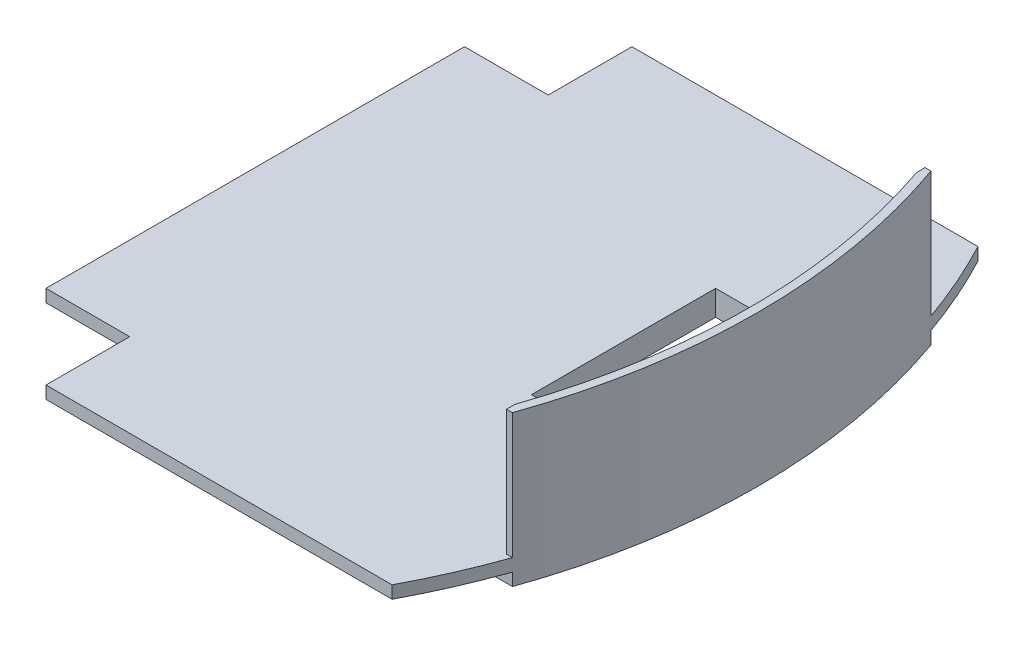
ISO-10303-21;
HEADER;
FILE_DESCRIPTION(('STEP AP214'),'2;1');
FILE_NAME('part.step','',(''),(''),'','','');
FILE_SCHEMA(('AUTOMOTIVE_DESIGN { 1 0 10303 214 1 1 1 1 }'));
ENDSEC;
DATA;
#1=APPLICATION_CONTEXT('core data for automotive mechanical design processes');
#2=APPLICATION_PROTOCOL_DEFINITION('international standard','automotive_design',2000,#1);
#3=PRODUCT_CONTEXT('',#1,'mechanical');
#4=PRODUCT('Part','Part','',(#3));
#5=PRODUCT_RELATED_PRODUCT_CATEGORY('part','',(#4));
#6=PRODUCT_DEFINITION_FORMATION('','',#4);
#7=PRODUCT_DEFINITION_CONTEXT('part definition',#1,'design');
#8=PRODUCT_DEFINITION('design','',#6,#7);
#9=PRODUCT_DEFINITION_SHAPE('','',#8);
#10=(LENGTH_UNIT() NAMED_UNIT(*) SI_UNIT(.MILLI.,.METRE.));
#11=(NAMED_UNIT(*) PLANE_ANGLE_UNIT() SI_UNIT($,.RADIAN.));
#12=(NAMED_UNIT(*) SI_UNIT($,.STERADIAN.) SOLID_ANGLE_UNIT());
#13=UNCERTAINTY_MEASURE_WITH_UNIT(LENGTH_MEASURE(1.E-05),#10,'distance_accuracy_value','');
#14=(GEOMETRIC_REPRESENTATION_CONTEXT(3) GLOBAL_UNCERTAINTY_ASSIGNED_CONTEXT((#13)) GLOBAL_UNIT_ASSIGNED_CONTEXT((#10,
#11,#12)) REPRESENTATION_CONTEXT('',''));
#15=CARTESIAN_POINT('',(0.,0.,0.));
#16=DIRECTION('',(0.,0.,1.));
#17=DIRECTION('',(1.,0.,0.));
#18=AXIS2_PLACEMENT_3D('',#15,#16,#17);
#19=CARTESIAN_POINT('',(-53.5929566320963,0.,0.));
#20=DIRECTION('',(0.,1.,0.));
#21=DIRECTION('',(0.,0.,1.));
#22=AXIS2_PLACEMENT_3D('',#19,#20,#21);
#23=PLANE('',#22);
#24=DIRECTION('',(1.,0.,0.));
#25=VECTOR('',#24,1.);
#26=CARTESIAN_POINT('',(89.9855488791226,0.,-50.));
#27=LINE('',#26,#25);
#28=CARTESIAN_POINT('',(49.9710977582451,0.,-50.));
#29=VERTEX_POINT('',#28);
#30=CARTESIAN_POINT('',(141.42135623731,0.,-50.));
#31=VERTEX_POINT('',#30);
#32=EDGE_CURVE('E222',#29,#31,#27,.T.);
#33=ORIENTED_EDGE('',*,*,#32,.T.);
#34=CARTESIAN_POINT('',(0.,0.,0.));
#35=DIRECTION('',(0.,1.,0.));
#36=DIRECTION('',(0.,0.,1.));
#37=AXIS2_PLACEMENT_3D('',#34,#35,#36);
#38=CIRCLE('',#37,150.);
#39=CARTESIAN_POINT('',(141.42135623731,0.,50.));
#40=VERTEX_POINT('',#39);
#41=EDGE_CURVE('E263',#40,#31,#38,.T.);
#42=ORIENTED_EDGE('',*,*,#41,.F.);
#43=DIRECTION('',(1.,0.,0.));
#44=VECTOR('',#43,1.);
#45=CARTESIAN_POINT('',(89.9855488791226,0.,50.));
#46=LINE('',#45,#44);
#47=CARTESIAN_POINT('',(49.9710977582451,0.,50.));
#48=VERTEX_POINT('',#47);
#49=EDGE_CURVE('E243',#48,#40,#46,.T.);
#50=ORIENTED_EDGE('',*,*,#49,.F.);
#51=DIRECTION('',(0.,0.,-1.));
#52=VECTOR('',#51,1.);
#53=CARTESIAN_POINT('',(49.9710977582451,0.,0.));
#54=LINE('',#53,#52);
#55=EDGE_CURVE('E268',#48,#29,#54,.T.);
#56=ORIENTED_EDGE('',*,*,#55,.T.);
#57=EDGE_LOOP('',(#33,#42,#50,#56));
#58=FACE_BOUND('',#57,.T.);
#59=DIRECTION('',(0.,0.,-1.));
#60=VECTOR('',#59,1.);
#61=CARTESIAN_POINT('',(130.971097758245,0.,-110.157318737628));
#62=LINE('',#61,#60);
#63=CARTESIAN_POINT('',(130.971097758245,0.,14.));
#64=VERTEX_POINT('',#63);
#65=CARTESIAN_POINT('',(130.971097758245,0.,-30.));
#66=VERTEX_POINT('',#65);
#67=EDGE_CURVE('E53',#64,#66,#62,.T.);
#68=ORIENTED_EDGE('',*,*,#67,.T.);
#69=DIRECTION('',(1.,0.,0.));
#70=VECTOR('',#69,1.);
#71=CARTESIAN_POINT('',(99.9855488791226,0.,-30.));
#72=LINE('',#71,#70);
#73=CARTESIAN_POINT('',(109.971097758245,0.,-30.));
#74=VERTEX_POINT('',#73);
#75=EDGE_CURVE('E392',#74,#66,#72,.T.);
#76=ORIENTED_EDGE('',*,*,#75,.F.);
#77=DIRECTION('',(0.,0.,-1.));
#78=VECTOR('',#77,1.);
#79=CARTESIAN_POINT('',(109.971097758245,0.,-110.157318737628));
#80=LINE('',#79,#78);
#81=CARTESIAN_POINT('',(109.971097758245,0.,14.));
#82=VERTEX_POINT('',#81);
#83=EDGE_CURVE('E396',#82,#74,#80,.T.);
#84=ORIENTED_EDGE('',*,*,#83,.F.);
#85=DIRECTION('',(1.,0.,0.));
#86=VECTOR('',#85,1.);
#87=CARTESIAN_POINT('',(99.9855488791226,0.,14.));
#88=LINE('',#87,#86);
#89=EDGE_CURVE('E399',#82,#64,#88,.T.);
#90=ORIENTED_EDGE('',*,*,#89,.T.);
#91=EDGE_LOOP('',(#68,#76,#84,#90));
#92=FACE_BOUND('',#91,.T.);
#93=ADVANCED_FACE('F35',(#58,#92),#23,.F.);
#94=CARTESIAN_POINT('',(-53.5929566320963,36.,0.));
#95=DIRECTION('',(0.,1.,0.));
#96=DIRECTION('',(0.,0.,1.));
#97=AXIS2_PLACEMENT_3D('',#94,#95,#96);
#98=PLANE('',#97);
#99=DIRECTION('',(0.,0.,1.));
#100=VECTOR('',#99,1.);
#101=CARTESIAN_POINT('',(140.,36.,-70.000025));
#102=LINE('',#101,#100);
#103=CARTESIAN_POINT('',(140.,36.,48.));
#104=VERTEX_POINT('',#103);
#105=CARTESIAN_POINT('',(140.,36.,50.));
#106=VERTEX_POINT('',#105);
#107=EDGE_CURVE('E412',#104,#106,#102,.T.);
#108=ORIENTED_EDGE('',*,*,#107,.T.);
#109=DIRECTION('',(1.,0.,0.));
#110=VECTOR('',#109,1.);
#111=CARTESIAN_POINT('',(-53.5929566320963,36.,50.));
#112=LINE('',#111,#110);
#113=CARTESIAN_POINT('',(141.42135623731,36.,50.));
#114=VERTEX_POINT('',#113);
#115=EDGE_CURVE('E200',#106,#114,#112,.T.);
#116=ORIENTED_EDGE('',*,*,#115,.T.);
#117=CARTESIAN_POINT('',(0.,36.,0.));
#118=DIRECTION('',(0.,1.,0.));
#119=DIRECTION('',(0.,0.,1.));
#120=AXIS2_PLACEMENT_3D('',#117,#118,#119);
#121=CIRCLE('',#120,150.);
#122=CARTESIAN_POINT('',(141.42135623731,36.,-50.));
#123=VERTEX_POINT('',#122);
#124=EDGE_CURVE('E216',#114,#123,#121,.T.);
#125=ORIENTED_EDGE('',*,*,#124,.T.);
#126=DIRECTION('',(1.,0.,0.));
#127=VECTOR('',#126,1.);
#128=CARTESIAN_POINT('',(-53.5929566320963,36.,-50.));
#129=LINE('',#128,#127);
#130=CARTESIAN_POINT('',(140.,36.,-50.));
#131=VERTEX_POINT('',#130);
#132=EDGE_CURVE('E207',#131,#123,#129,.T.);
#133=ORIENTED_EDGE('',*,*,#132,.F.);
#134=CARTESIAN_POINT('',(140.,36.,-48.));
#135=VERTEX_POINT('',#134);
#136=EDGE_CURVE('E410',#131,#135,#102,.T.);
#137=ORIENTED_EDGE('',*,*,#136,.T.);
#138=CARTESIAN_POINT('',(0.,36.,0.));
#139=DIRECTION('',(0.,1.,0.));
#140=DIRECTION('',(0.,0.,1.));
#141=AXIS2_PLACEMENT_3D('',#138,#139,#140);
#142=CIRCLE('',#141,148.);
#143=EDGE_CURVE('E374',#104,#135,#142,.T.);
#144=ORIENTED_EDGE('',*,*,#143,.F.);
#145=EDGE_LOOP('',(#108,#116,#125,#133,#137,#144));
#146=FACE_BOUND('',#145,.T.);
#147=ADVANCED_FACE('F420',(#146),#98,.T.);
#148=CARTESIAN_POINT('',(-53.5929566320963,6.,0.));
#149=DIRECTION('',(0.,1.,0.));
#150=DIRECTION('',(0.,0.,1.));
#151=AXIS2_PLACEMENT_3D('',#148,#149,#150);
#152=PLANE('',#151);
#153=DIRECTION('',(1.,0.,0.));
#154=VECTOR('',#153,1.);
#155=CARTESIAN_POINT('',(-53.5929566320963,6.,50.));
#156=LINE('',#155,#154);
#157=CARTESIAN_POINT('',(140.,6.,50.));
#158=VERTEX_POINT('',#157);
#159=CARTESIAN_POINT('',(141.42135623731,6.,50.));
#160=VERTEX_POINT('',#159);
#161=EDGE_CURVE('E198',#158,#160,#156,.T.);
#162=ORIENTED_EDGE('',*,*,#161,.F.);
#163=DIRECTION('',(0.,0.,1.));
#164=VECTOR('',#163,1.);
#165=CARTESIAN_POINT('',(140.,6.,-70.000025));
#166=LINE('',#165,#164);
#167=CARTESIAN_POINT('',(140.,6.,48.));
#168=VERTEX_POINT('',#167);
#169=EDGE_CURVE('E181',#168,#158,#166,.T.);
#170=ORIENTED_EDGE('',*,*,#169,.F.);
#171=CARTESIAN_POINT('',(0.,6.,0.));
#172=DIRECTION('',(0.,1.,0.));
#173=DIRECTION('',(0.,0.,1.));
#174=AXIS2_PLACEMENT_3D('',#171,#172,#173);
#175=CIRCLE('',#174,148.);
#176=CARTESIAN_POINT('',(140.,6.,-48.));
#177=VERTEX_POINT('',#176);
#178=EDGE_CURVE('E378',#168,#177,#175,.T.);
#179=ORIENTED_EDGE('',*,*,#178,.T.);
#180=CARTESIAN_POINT('',(140.,6.,-50.));
#181=VERTEX_POINT('',#180);
#182=EDGE_CURVE('E192',#181,#177,#166,.T.);
#183=ORIENTED_EDGE('',*,*,#182,.F.);
#184=DIRECTION('',(1.,0.,0.));
#185=VECTOR('',#184,1.);
#186=CARTESIAN_POINT('',(-53.5929566320963,6.,-50.));
#187=LINE('',#186,#185);
#188=CARTESIAN_POINT('',(141.42135623731,6.,-50.));
#189=VERTEX_POINT('',#188);
#190=EDGE_CURVE('E39',#181,#189,#187,.T.);
#191=ORIENTED_EDGE('',*,*,#190,.T.);
#192=CARTESIAN_POINT('',(0.,6.,0.));
#193=DIRECTION('',(0.,1.,0.));
#194=DIRECTION('',(0.,0.,1.));
#195=AXIS2_PLACEMENT_3D('',#192,#193,#194);
#196=CIRCLE('',#195,150.);
#197=CARTESIAN_POINT('',(132.664991614216,6.,-70.));
#198=VERTEX_POINT('',#197);
#199=EDGE_CURVE('E272',#189,#198,#196,.T.);
#200=ORIENTED_EDGE('',*,*,#199,.T.);
#201=DIRECTION('',(1.,0.,0.));
#202=VECTOR('',#201,1.);
#203=CARTESIAN_POINT('',(-53.5929566320963,6.,-70.));
#204=LINE('',#203,#202);
#205=CARTESIAN_POINT('',(49.9710977582451,6.,-70.));
#206=VERTEX_POINT('',#205);
#207=EDGE_CURVE('E275',#206,#198,#204,.T.);
#208=ORIENTED_EDGE('',*,*,#207,.F.);
#209=DIRECTION('',(0.,0.,-1.));
#210=VECTOR('',#209,1.);
#211=CARTESIAN_POINT('',(49.9710977582451,6.,0.));
#212=LINE('',#211,#210);
#213=CARTESIAN_POINT('',(49.9710977582451,6.,-50.));
#214=VERTEX_POINT('',#213);
#215=EDGE_CURVE('E310',#214,#206,#212,.T.);
#216=ORIENTED_EDGE('',*,*,#215,.F.);
#217=DIRECTION('',(1.,0.,0.));
#218=VECTOR('',#217,1.);
#219=CARTESIAN_POINT('',(-53.5929566320963,6.,-50.));
#220=LINE('',#219,#218);
#221=CARTESIAN_POINT('',(29.9710977582451,6.,-50.));
#222=VERTEX_POINT('',#221);
#223=EDGE_CURVE('E308',#222,#214,#220,.T.);
#224=ORIENTED_EDGE('',*,*,#223,.F.);
#225=DIRECTION('',(0.,0.,-1.));
#226=VECTOR('',#225,1.);
#227=CARTESIAN_POINT('',(29.9710977582451,6.,0.));
#228=LINE('',#227,#226);
#229=CARTESIAN_POINT('',(29.9710977582451,6.,50.));
#230=VERTEX_POINT('',#229);
#231=EDGE_CURVE('E301',#230,#222,#228,.T.);
#232=ORIENTED_EDGE('',*,*,#231,.F.);
#233=DIRECTION('',(1.,0.,0.));
#234=VECTOR('',#233,1.);
#235=CARTESIAN_POINT('',(-53.5929566320963,6.,50.));
#236=LINE('',#235,#234);
#237=CARTESIAN_POINT('',(49.9710977582451,6.,50.));
#238=VERTEX_POINT('',#237);
#239=EDGE_CURVE('E264',#230,#238,#236,.T.);
#240=ORIENTED_EDGE('',*,*,#239,.T.);
#241=DIRECTION('',(0.,0.,1.));
#242=VECTOR('',#241,1.);
#243=CARTESIAN_POINT('',(49.9710977582451,6.,0.));
#244=LINE('',#243,#242);
#245=CARTESIAN_POINT('',(49.9710977582451,6.,70.));
#246=VERTEX_POINT('',#245);
#247=EDGE_CURVE('E267',#238,#246,#244,.T.);
#248=ORIENTED_EDGE('',*,*,#247,.T.);
#249=DIRECTION('',(1.,0.,0.));
#250=VECTOR('',#249,1.);
#251=CARTESIAN_POINT('',(-53.5929566320963,6.,70.));
#252=LINE('',#251,#250);
#253=CARTESIAN_POINT('',(132.664991614216,6.,70.));
#254=VERTEX_POINT('',#253);
#255=EDGE_CURVE('E270',#246,#254,#252,.T.);
#256=ORIENTED_EDGE('',*,*,#255,.T.);
#257=EDGE_CURVE('E205',#254,#160,#196,.T.);
#258=ORIENTED_EDGE('',*,*,#257,.T.);
#259=EDGE_LOOP('',(#162,#170,#179,#183,#191,#200,#208,#216,#224,#232,#240,#248,#256,#258));
#260=FACE_BOUND('',#259,.T.);
#261=DIRECTION('',(1.,0.,0.));
#262=VECTOR('',#261,1.);
#263=CARTESIAN_POINT('',(99.9855488791226,6.,-30.));
#264=LINE('',#263,#262);
#265=CARTESIAN_POINT('',(109.971097758245,6.,-30.));
#266=VERTEX_POINT('',#265);
#267=CARTESIAN_POINT('',(130.971097758245,6.,-30.));
#268=VERTEX_POINT('',#267);
#269=EDGE_CURVE('E387',#266,#268,#264,.T.);
#270=ORIENTED_EDGE('',*,*,#269,.T.);
#271=DIRECTION('',(0.,0.,-1.));
#272=VECTOR('',#271,1.);
#273=CARTESIAN_POINT('',(130.971097758245,6.,-110.157318737628));
#274=LINE('',#273,#272);
#275=CARTESIAN_POINT('',(130.971097758245,6.,14.));
#276=VERTEX_POINT('',#275);
#277=EDGE_CURVE('E395',#276,#268,#274,.T.);
#278=ORIENTED_EDGE('',*,*,#277,.F.);
#279=DIRECTION('',(1.,0.,0.));
#280=VECTOR('',#279,1.);
#281=CARTESIAN_POINT('',(99.9855488791226,6.,14.));
#282=LINE('',#281,#280);
#283=CARTESIAN_POINT('',(109.971097758245,6.,14.));
#284=VERTEX_POINT('',#283);
#285=EDGE_CURVE('E407',#284,#276,#282,.T.);
#286=ORIENTED_EDGE('',*,*,#285,.F.);
#287=DIRECTION('',(0.,0.,-1.));
#288=VECTOR('',#287,1.);
#289=CARTESIAN_POINT('',(109.971097758245,6.,-110.157318737628));
#290=LINE('',#289,#288);
#291=EDGE_CURVE('E61',#284,#266,#290,.T.);
#292=ORIENTED_EDGE('',*,*,#291,.T.);
#293=EDGE_LOOP('',(#270,#278,#286,#292));
#294=FACE_BOUND('',#293,.T.);
#295=ADVANCED_FACE('F202',(#260,#294),#152,.T.);
#296=CARTESIAN_POINT('',(0.,6.,0.));
#297=DIRECTION('',(0.,-1.,0.));
#298=DIRECTION('',(0.,0.,-1.));
#299=AXIS2_PLACEMENT_3D('',#296,#297,#298);
#300=CYLINDRICAL_SURFACE('',#299,150.);
#301=DIRECTION('',(0.,-1.,0.));
#302=VECTOR('',#301,1.);
#303=CARTESIAN_POINT('',(141.42135623731,36.,50.));
#304=LINE('',#303,#302);
#305=EDGE_CURVE('E228',#114,#160,#304,.T.);
#306=ORIENTED_EDGE('',*,*,#305,.T.);
#307=ORIENTED_EDGE('',*,*,#257,.F.);
#308=DIRECTION('',(0.,-1.,0.));
#309=VECTOR('',#308,1.);
#310=CARTESIAN_POINT('',(132.664991614216,6.,70.));
#311=LINE('',#310,#309);
#312=CARTESIAN_POINT('',(132.664991614216,3.,70.));
#313=VERTEX_POINT('',#312);
#314=EDGE_CURVE('E283',#254,#313,#311,.T.);
#315=ORIENTED_EDGE('',*,*,#314,.T.);
#316=CARTESIAN_POINT('',(0.,3.,0.));
#317=DIRECTION('',(0.,-1.,0.));
#318=DIRECTION('',(0.,0.,-1.));
#319=AXIS2_PLACEMENT_3D('',#316,#317,#318);
#320=CIRCLE('',#319,150.);
#321=CARTESIAN_POINT('',(141.42135623731,3.,50.));
#322=VERTEX_POINT('',#321);
#323=EDGE_CURVE('E248',#322,#313,#320,.T.);
#324=ORIENTED_EDGE('',*,*,#323,.F.);
#325=DIRECTION('',(0.,-1.,0.));
#326=VECTOR('',#325,1.);
#327=CARTESIAN_POINT('',(141.42135623731,3.,50.));
#328=LINE('',#327,#326);
#329=EDGE_CURVE('E240',#322,#40,#328,.T.);
#330=ORIENTED_EDGE('',*,*,#329,.T.);
#331=ORIENTED_EDGE('',*,*,#41,.T.);
#332=DIRECTION('',(0.,-1.,0.));
#333=VECTOR('',#332,1.);
#334=CARTESIAN_POINT('',(141.42135623731,3.,-50.));
#335=LINE('',#334,#333);
#336=CARTESIAN_POINT('',(141.42135623731,3.,-50.));
#337=VERTEX_POINT('',#336);
#338=EDGE_CURVE('E223',#337,#31,#335,.T.);
#339=ORIENTED_EDGE('',*,*,#338,.F.);
#340=CARTESIAN_POINT('',(0.,3.,0.));
#341=DIRECTION('',(0.,-1.,0.));
#342=DIRECTION('',(0.,0.,-1.));
#343=AXIS2_PLACEMENT_3D('',#340,#341,#342);
#344=CIRCLE('',#343,150.);
#345=CARTESIAN_POINT('',(132.664991614216,3.,-70.));
#346=VERTEX_POINT('',#345);
#347=EDGE_CURVE('E221',#346,#337,#344,.T.);
#348=ORIENTED_EDGE('',*,*,#347,.F.);
#349=DIRECTION('',(0.,-1.,0.));
#350=VECTOR('',#349,1.);
#351=CARTESIAN_POINT('',(132.664991614216,6.,-70.));
#352=LINE('',#351,#350);
#353=EDGE_CURVE('E286',#198,#346,#352,.T.);
#354=ORIENTED_EDGE('',*,*,#353,.F.);
#355=ORIENTED_EDGE('',*,*,#199,.F.);
#356=DIRECTION('',(0.,-1.,0.));
#357=VECTOR('',#356,1.);
#358=CARTESIAN_POINT('',(141.42135623731,36.,-50.));
#359=LINE('',#358,#357);
#360=EDGE_CURVE('E365',#123,#189,#359,.T.);
#361=ORIENTED_EDGE('',*,*,#360,.F.);
#362=ORIENTED_EDGE('',*,*,#124,.F.);
#363=EDGE_LOOP('',(#306,#307,#315,#324,#330,#331,#339,#348,#354,#355,#361,#362));
#364=FACE_BOUND('',#363,.T.);
#365=ADVANCED_FACE('F328',(#364),#300,.T.);
#366=CARTESIAN_POINT('',(-53.5929566320963,6.,-70.));
#367=DIRECTION('',(0.,0.,-1.));
#368=DIRECTION('',(-1.,0.,0.));
#369=AXIS2_PLACEMENT_3D('',#366,#367,#368);
#370=PLANE('',#369);
#371=ORIENTED_EDGE('',*,*,#353,.T.);
#372=DIRECTION('',(1.,0.,0.));
#373=VECTOR('',#372,1.);
#374=CARTESIAN_POINT('',(89.9855488791226,3.,-70.));
#375=LINE('',#374,#373);
#376=CARTESIAN_POINT('',(49.9710977582451,3.,-70.));
#377=VERTEX_POINT('',#376);
#378=EDGE_CURVE('E225',#377,#346,#375,.T.);
#379=ORIENTED_EDGE('',*,*,#378,.F.);
#380=DIRECTION('',(0.,-1.,0.));
#381=VECTOR('',#380,1.);
#382=CARTESIAN_POINT('',(49.9710977582451,6.,-70.));
#383=LINE('',#382,#381);
#384=EDGE_CURVE('E289',#206,#377,#383,.T.);
#385=ORIENTED_EDGE('',*,*,#384,.F.);
#386=ORIENTED_EDGE('',*,*,#207,.T.);
#387=EDGE_LOOP('',(#371,#379,#385,#386));
#388=FACE_BOUND('',#387,.T.);
#389=ADVANCED_FACE('F317',(#388),#370,.T.);
#390=CARTESIAN_POINT('',(49.9710977582451,6.,0.));
#391=DIRECTION('',(-1.,0.,0.));
#392=DIRECTION('',(0.,0.,1.));
#393=AXIS2_PLACEMENT_3D('',#390,#391,#392);
#394=PLANE('',#393);
#395=DIRECTION('',(0.,0.,-1.));
#396=VECTOR('',#395,1.);
#397=CARTESIAN_POINT('',(49.9710977582451,3.,-143.578505511219));
#398=LINE('',#397,#396);
#399=CARTESIAN_POINT('',(49.9710977582451,3.,50.));
#400=VERTEX_POINT('',#399);
#401=CARTESIAN_POINT('',(49.9710977582451,3.,-50.));
#402=VERTEX_POINT('',#401);
#403=EDGE_CURVE('E246',#400,#402,#398,.T.);
#404=ORIENTED_EDGE('',*,*,#403,.T.);
#405=DIRECTION('',(0.,-1.,0.));
#406=VECTOR('',#405,1.);
#407=CARTESIAN_POINT('',(49.9710977582451,3.,-50.));
#408=LINE('',#407,#406);
#409=EDGE_CURVE('E218',#402,#29,#408,.T.);
#410=ORIENTED_EDGE('',*,*,#409,.T.);
#411=ORIENTED_EDGE('',*,*,#55,.F.);
#412=DIRECTION('',(0.,-1.,0.));
#413=VECTOR('',#412,1.);
#414=CARTESIAN_POINT('',(49.9710977582451,3.,50.));
#415=LINE('',#414,#413);
#416=EDGE_CURVE('E237',#400,#48,#415,.T.);
#417=ORIENTED_EDGE('',*,*,#416,.F.);
#418=EDGE_LOOP('',(#404,#410,#411,#417));
#419=FACE_BOUND('',#418,.T.);
#420=ADVANCED_FACE('F338',(#419),#394,.T.);
#421=ORIENTED_EDGE('',*,*,#384,.T.);
#422=DIRECTION('',(0.,0.,-1.));
#423=VECTOR('',#422,1.);
#424=CARTESIAN_POINT('',(49.9710977582451,3.,-143.578505511219));
#425=LINE('',#424,#423);
#426=EDGE_CURVE('E232',#402,#377,#425,.T.);
#427=ORIENTED_EDGE('',*,*,#426,.F.);
#428=DIRECTION('',(0.,-1.,0.));
#429=VECTOR('',#428,1.);
#430=CARTESIAN_POINT('',(49.9710977582451,6.,-50.));
#431=LINE('',#430,#429);
#432=EDGE_CURVE('E292',#214,#402,#431,.T.);
#433=ORIENTED_EDGE('',*,*,#432,.F.);
#434=ORIENTED_EDGE('',*,*,#215,.T.);
#435=EDGE_LOOP('',(#421,#427,#433,#434));
#436=FACE_BOUND('',#435,.T.);
#437=ADVANCED_FACE('F334',(#436),#394,.T.);
#438=CARTESIAN_POINT('',(-53.5929566320963,6.,70.));
#439=DIRECTION('',(0.,0.,-1.));
#440=DIRECTION('',(-1.,0.,0.));
#441=AXIS2_PLACEMENT_3D('',#438,#439,#440);
#442=PLANE('',#441);
#443=DIRECTION('',(-1.,0.,0.));
#444=VECTOR('',#443,1.);
#445=CARTESIAN_POINT('',(89.9855488791226,3.,70.));
#446=LINE('',#445,#444);
#447=CARTESIAN_POINT('',(49.9710977582451,3.,70.));
#448=VERTEX_POINT('',#447);
#449=EDGE_CURVE('E239',#313,#448,#446,.T.);
#450=ORIENTED_EDGE('',*,*,#449,.F.);
#451=ORIENTED_EDGE('',*,*,#314,.F.);
#452=ORIENTED_EDGE('',*,*,#255,.F.);
#453=DIRECTION('',(0.,-1.,0.));
#454=VECTOR('',#453,1.);
#455=CARTESIAN_POINT('',(49.9710977582451,6.,70.));
#456=LINE('',#455,#454);
#457=EDGE_CURVE('E45',#246,#448,#456,.T.);
#458=ORIENTED_EDGE('',*,*,#457,.T.);
#459=EDGE_LOOP('',(#450,#451,#452,#458));
#460=FACE_BOUND('',#459,.T.);
#461=ADVANCED_FACE('F361',(#460),#442,.F.);
#462=DIRECTION('',(0.,-1.,0.));
#463=VECTOR('',#462,1.);
#464=CARTESIAN_POINT('',(49.9710977582451,6.,50.));
#465=LINE('',#464,#463);
#466=EDGE_CURVE('E11',#238,#400,#465,.T.);
#467=ORIENTED_EDGE('',*,*,#466,.T.);
#468=DIRECTION('',(0.,0.,-1.));
#469=VECTOR('',#468,1.);
#470=CARTESIAN_POINT('',(49.9710977582451,3.,-143.578505511219));
#471=LINE('',#470,#469);
#472=EDGE_CURVE('E236',#448,#400,#471,.T.);
#473=ORIENTED_EDGE('',*,*,#472,.F.);
#474=ORIENTED_EDGE('',*,*,#457,.F.);
#475=ORIENTED_EDGE('',*,*,#247,.F.);
#476=EDGE_LOOP('',(#467,#473,#474,#475));
#477=FACE_BOUND('',#476,.T.);
#478=ADVANCED_FACE('F355',(#477),#394,.T.);
#479=CARTESIAN_POINT('',(-53.5929566320963,6.,50.));
#480=DIRECTION('',(0.,0.,-1.));
#481=DIRECTION('',(-1.,0.,0.));
#482=AXIS2_PLACEMENT_3D('',#479,#480,#481);
#483=PLANE('',#482);
#484=DIRECTION('',(-1.,0.,0.));
#485=VECTOR('',#484,1.);
#486=CARTESIAN_POINT('',(89.9855488791226,3.,50.));
#487=LINE('',#486,#485);
#488=CARTESIAN_POINT('',(29.9710977582451,3.,50.));
#489=VERTEX_POINT('',#488);
#490=EDGE_CURVE('E256',#400,#489,#487,.T.);
#491=ORIENTED_EDGE('',*,*,#490,.F.);
#492=ORIENTED_EDGE('',*,*,#466,.F.);
#493=ORIENTED_EDGE('',*,*,#239,.F.);
#494=DIRECTION('',(0.,-1.,0.));
#495=VECTOR('',#494,1.);
#496=CARTESIAN_POINT('',(29.9710977582451,6.,50.));
#497=LINE('',#496,#495);
#498=EDGE_CURVE('E298',#230,#489,#497,.T.);
#499=ORIENTED_EDGE('',*,*,#498,.T.);
#500=EDGE_LOOP('',(#491,#492,#493,#499));
#501=FACE_BOUND('',#500,.T.);
#502=ADVANCED_FACE('F37',(#501),#483,.F.);
#503=CARTESIAN_POINT('',(-53.5929566320963,6.,-50.));
#504=DIRECTION('',(0.,0.,-1.));
#505=DIRECTION('',(-1.,0.,0.));
#506=AXIS2_PLACEMENT_3D('',#503,#504,#505);
#507=PLANE('',#506);
#508=ORIENTED_EDGE('',*,*,#432,.T.);
#509=DIRECTION('',(1.,0.,0.));
#510=VECTOR('',#509,1.);
#511=CARTESIAN_POINT('',(89.9855488791226,3.,-50.));
#512=LINE('',#511,#510);
#513=CARTESIAN_POINT('',(29.9710977582451,3.,-50.));
#514=VERTEX_POINT('',#513);
#515=EDGE_CURVE('E260',#514,#402,#512,.T.);
#516=ORIENTED_EDGE('',*,*,#515,.F.);
#517=DIRECTION('',(0.,-1.,0.));
#518=VECTOR('',#517,1.);
#519=CARTESIAN_POINT('',(29.9710977582451,6.,-50.));
#520=LINE('',#519,#518);
#521=EDGE_CURVE('E295',#222,#514,#520,.T.);
#522=ORIENTED_EDGE('',*,*,#521,.F.);
#523=ORIENTED_EDGE('',*,*,#223,.T.);
#524=EDGE_LOOP('',(#508,#516,#522,#523));
#525=FACE_BOUND('',#524,.T.);
#526=ADVANCED_FACE('F346',(#525),#507,.T.);
#527=CARTESIAN_POINT('',(29.9710977582451,6.,0.));
#528=DIRECTION('',(-1.,0.,0.));
#529=DIRECTION('',(0.,0.,1.));
#530=AXIS2_PLACEMENT_3D('',#527,#528,#529);
#531=PLANE('',#530);
#532=ORIENTED_EDGE('',*,*,#521,.T.);
#533=DIRECTION('',(0.,0.,-1.));
#534=VECTOR('',#533,1.);
#535=CARTESIAN_POINT('',(29.9710977582451,3.,-143.578505511219));
#536=LINE('',#535,#534);
#537=EDGE_CURVE('E258',#489,#514,#536,.T.);
#538=ORIENTED_EDGE('',*,*,#537,.F.);
#539=ORIENTED_EDGE('',*,*,#498,.F.);
#540=ORIENTED_EDGE('',*,*,#231,.T.);
#541=EDGE_LOOP('',(#532,#538,#539,#540));
#542=FACE_BOUND('',#541,.T.);
#543=ADVANCED_FACE('F349',(#542),#531,.T.);
#544=CARTESIAN_POINT('',(89.9855488791226,3.,-143.578505511219));
#545=DIRECTION('',(0.,-1.,0.));
#546=DIRECTION('',(0.,0.,-1.));
#547=AXIS2_PLACEMENT_3D('',#544,#545,#546);
#548=PLANE('',#547);
#549=ORIENTED_EDGE('',*,*,#403,.F.);
#550=ORIENTED_EDGE('',*,*,#490,.T.);
#551=ORIENTED_EDGE('',*,*,#537,.T.);
#552=ORIENTED_EDGE('',*,*,#515,.T.);
#553=EDGE_LOOP('',(#549,#550,#551,#552));
#554=FACE_BOUND('',#553,.T.);
#555=ADVANCED_FACE('F343',(#554),#548,.T.);
#556=CARTESIAN_POINT('',(89.9855488791226,3.,50.));
#557=DIRECTION('',(0.,0.,-1.));
#558=DIRECTION('',(-1.,0.,0.));
#559=AXIS2_PLACEMENT_3D('',#556,#557,#558);
#560=PLANE('',#559);
#561=ORIENTED_EDGE('',*,*,#49,.T.);
#562=ORIENTED_EDGE('',*,*,#329,.F.);
#563=DIRECTION('',(1.,0.,0.));
#564=VECTOR('',#563,1.);
#565=CARTESIAN_POINT('',(89.9855488791226,3.,50.));
#566=LINE('',#565,#564);
#567=EDGE_CURVE('E244',#400,#322,#566,.T.);
#568=ORIENTED_EDGE('',*,*,#567,.F.);
#569=ORIENTED_EDGE('',*,*,#416,.T.);
#570=EDGE_LOOP('',(#561,#562,#568,#569));
#571=FACE_BOUND('',#570,.T.);
#572=ADVANCED_FACE('F489',(#571),#560,.F.);
#573=CARTESIAN_POINT('',(89.9855488791226,3.,-143.578505511219));
#574=DIRECTION('',(0.,-1.,0.));
#575=DIRECTION('',(0.,0.,-1.));
#576=AXIS2_PLACEMENT_3D('',#573,#574,#575);
#577=PLANE('',#576);
#578=ORIENTED_EDGE('',*,*,#472,.T.);
#579=ORIENTED_EDGE('',*,*,#567,.T.);
#580=ORIENTED_EDGE('',*,*,#323,.T.);
#581=ORIENTED_EDGE('',*,*,#449,.T.);
#582=EDGE_LOOP('',(#578,#579,#580,#581));
#583=FACE_BOUND('',#582,.T.);
#584=ADVANCED_FACE('F495',(#583),#577,.T.);
#585=CARTESIAN_POINT('',(89.9855488791226,3.,-50.));
#586=DIRECTION('',(0.,0.,-1.));
#587=DIRECTION('',(-1.,0.,0.));
#588=AXIS2_PLACEMENT_3D('',#585,#586,#587);
#589=PLANE('',#588);
#590=ORIENTED_EDGE('',*,*,#32,.F.);
#591=ORIENTED_EDGE('',*,*,#409,.F.);
#592=DIRECTION('',(1.,0.,0.));
#593=VECTOR('',#592,1.);
#594=CARTESIAN_POINT('',(89.9855488791226,3.,-50.));
#595=LINE('',#594,#593);
#596=EDGE_CURVE('E234',#402,#337,#595,.T.);
#597=ORIENTED_EDGE('',*,*,#596,.T.);
#598=ORIENTED_EDGE('',*,*,#338,.T.);
#599=EDGE_LOOP('',(#590,#591,#597,#598));
#600=FACE_BOUND('',#599,.T.);
#601=ADVANCED_FACE('F430',(#600),#589,.T.);
#602=CARTESIAN_POINT('',(89.9855488791226,3.,-143.578505511219));
#603=DIRECTION('',(0.,-1.,0.));
#604=DIRECTION('',(0.,0.,-1.));
#605=AXIS2_PLACEMENT_3D('',#602,#603,#604);
#606=PLANE('',#605);
#607=ORIENTED_EDGE('',*,*,#596,.F.);
#608=ORIENTED_EDGE('',*,*,#426,.T.);
#609=ORIENTED_EDGE('',*,*,#378,.T.);
#610=ORIENTED_EDGE('',*,*,#347,.T.);
#611=EDGE_LOOP('',(#607,#608,#609,#610));
#612=FACE_BOUND('',#611,.T.);
#613=ADVANCED_FACE('F331',(#612),#606,.T.);
#614=CARTESIAN_POINT('',(-53.5929566320963,36.,-50.));
#615=DIRECTION('',(0.,0.,-1.));
#616=DIRECTION('',(-1.,0.,0.));
#617=AXIS2_PLACEMENT_3D('',#614,#615,#616);
#618=PLANE('',#617);
#619=DIRECTION('',(0.,-1.,0.));
#620=VECTOR('',#619,1.);
#621=CARTESIAN_POINT('',(140.,36.0000000000002,-50.));
#622=LINE('',#621,#620);
#623=EDGE_CURVE('E403',#131,#181,#622,.T.);
#624=ORIENTED_EDGE('',*,*,#623,.F.);
#625=ORIENTED_EDGE('',*,*,#132,.T.);
#626=ORIENTED_EDGE('',*,*,#360,.T.);
#627=ORIENTED_EDGE('',*,*,#190,.F.);
#628=EDGE_LOOP('',(#624,#625,#626,#627));
#629=FACE_BOUND('',#628,.T.);
#630=ADVANCED_FACE('F421',(#629),#618,.T.);
#631=CARTESIAN_POINT('',(-53.5929566320963,36.,50.));
#632=DIRECTION('',(0.,0.,-1.));
#633=DIRECTION('',(-1.,0.,0.));
#634=AXIS2_PLACEMENT_3D('',#631,#632,#633);
#635=PLANE('',#634);
#636=ORIENTED_EDGE('',*,*,#115,.F.);
#637=DIRECTION('',(0.,1.,0.));
#638=VECTOR('',#637,1.);
#639=CARTESIAN_POINT('',(140.,36.,50.));
#640=LINE('',#639,#638);
#641=EDGE_CURVE('E184',#158,#106,#640,.T.);
#642=ORIENTED_EDGE('',*,*,#641,.F.);
#643=ORIENTED_EDGE('',*,*,#161,.T.);
#644=ORIENTED_EDGE('',*,*,#305,.F.);
#645=EDGE_LOOP('',(#636,#642,#643,#644));
#646=FACE_BOUND('',#645,.T.);
#647=ADVANCED_FACE('F196',(#646),#635,.F.);
#648=CARTESIAN_POINT('',(0.,6.,0.));
#649=DIRECTION('',(0.,-1.,0.));
#650=DIRECTION('',(0.,0.,-1.));
#651=AXIS2_PLACEMENT_3D('',#648,#649,#650);
#652=CYLINDRICAL_SURFACE('',#651,148.);
#653=ORIENTED_EDGE('',*,*,#178,.F.);
#654=DIRECTION('',(0.,-1.,0.));
#655=VECTOR('',#654,1.);
#656=CARTESIAN_POINT('',(140.,5.,48.));
#657=LINE('',#656,#655);
#658=EDGE_CURVE('E187',#104,#168,#657,.T.);
#659=ORIENTED_EDGE('',*,*,#658,.F.);
#660=ORIENTED_EDGE('',*,*,#143,.T.);
#661=DIRECTION('',(0.,-1.,0.));
#662=VECTOR('',#661,1.);
#663=CARTESIAN_POINT('',(140.,5.,-48.));
#664=LINE('',#663,#662);
#665=EDGE_CURVE('E377',#135,#177,#664,.T.);
#666=ORIENTED_EDGE('',*,*,#665,.T.);
#667=EDGE_LOOP('',(#653,#659,#660,#666));
#668=FACE_BOUND('',#667,.T.);
#669=ADVANCED_FACE('F419',(#668),#652,.F.);
#670=CARTESIAN_POINT('',(130.971097758245,6.,-110.157318737628));
#671=DIRECTION('',(-1.,0.,0.));
#672=DIRECTION('',(0.,0.,1.));
#673=AXIS2_PLACEMENT_3D('',#670,#671,#672);
#674=PLANE('',#673);
#675=ORIENTED_EDGE('',*,*,#67,.F.);
#676=DIRECTION('',(0.,-1.,0.));
#677=VECTOR('',#676,1.);
#678=CARTESIAN_POINT('',(130.971097758245,6.,14.));
#679=LINE('',#678,#677);
#680=EDGE_CURVE('E384',#276,#64,#679,.T.);
#681=ORIENTED_EDGE('',*,*,#680,.F.);
#682=ORIENTED_EDGE('',*,*,#277,.T.);
#683=DIRECTION('',(0.,-1.,0.));
#684=VECTOR('',#683,1.);
#685=CARTESIAN_POINT('',(130.971097758245,6.,-30.));
#686=LINE('',#685,#684);
#687=EDGE_CURVE('E383',#268,#66,#686,.T.);
#688=ORIENTED_EDGE('',*,*,#687,.T.);
#689=EDGE_LOOP('',(#675,#681,#682,#688));
#690=FACE_BOUND('',#689,.T.);
#691=ADVANCED_FACE('F533',(#690),#674,.T.);
#692=CARTESIAN_POINT('',(99.9855488791226,6.,-30.));
#693=DIRECTION('',(0.,0.,-1.));
#694=DIRECTION('',(-1.,0.,0.));
#695=AXIS2_PLACEMENT_3D('',#692,#693,#694);
#696=PLANE('',#695);
#697=ORIENTED_EDGE('',*,*,#75,.T.);
#698=ORIENTED_EDGE('',*,*,#687,.F.);
#699=ORIENTED_EDGE('',*,*,#269,.F.);
#700=DIRECTION('',(0.,-1.,0.));
#701=VECTOR('',#700,1.);
#702=CARTESIAN_POINT('',(109.971097758245,6.,-30.));
#703=LINE('',#702,#701);
#704=EDGE_CURVE('E389',#266,#74,#703,.T.);
#705=ORIENTED_EDGE('',*,*,#704,.T.);
#706=EDGE_LOOP('',(#697,#698,#699,#705));
#707=FACE_BOUND('',#706,.T.);
#708=ADVANCED_FACE('F544',(#707),#696,.F.);
#709=CARTESIAN_POINT('',(109.971097758245,6.,-110.157318737628));
#710=DIRECTION('',(-1.,0.,0.));
#711=DIRECTION('',(0.,0.,1.));
#712=AXIS2_PLACEMENT_3D('',#709,#710,#711);
#713=PLANE('',#712);
#714=ORIENTED_EDGE('',*,*,#83,.T.);
#715=ORIENTED_EDGE('',*,*,#704,.F.);
#716=ORIENTED_EDGE('',*,*,#291,.F.);
#717=DIRECTION('',(0.,-1.,0.));
#718=VECTOR('',#717,1.);
#719=CARTESIAN_POINT('',(109.971097758245,6.,14.));
#720=LINE('',#719,#718);
#721=EDGE_CURVE('E386',#284,#82,#720,.T.);
#722=ORIENTED_EDGE('',*,*,#721,.T.);
#723=EDGE_LOOP('',(#714,#715,#716,#722));
#724=FACE_BOUND('',#723,.T.);
#725=ADVANCED_FACE('F551',(#724),#713,.F.);
#726=CARTESIAN_POINT('',(99.9855488791226,6.,14.));
#727=DIRECTION('',(0.,0.,-1.));
#728=DIRECTION('',(-1.,0.,0.));
#729=AXIS2_PLACEMENT_3D('',#726,#727,#728);
#730=PLANE('',#729);
#731=ORIENTED_EDGE('',*,*,#89,.F.);
#732=ORIENTED_EDGE('',*,*,#721,.F.);
#733=ORIENTED_EDGE('',*,*,#285,.T.);
#734=ORIENTED_EDGE('',*,*,#680,.T.);
#735=EDGE_LOOP('',(#731,#732,#733,#734));
#736=FACE_BOUND('',#735,.T.);
#737=ADVANCED_FACE('F559',(#736),#730,.T.);
#738=CARTESIAN_POINT('',(140.,36.,-70.000025));
#739=DIRECTION('',(1.,0.,0.));
#740=DIRECTION('',(0.,1.,0.));
#741=AXIS2_PLACEMENT_3D('',#738,#739,#740);
#742=PLANE('',#741);
#743=ORIENTED_EDGE('',*,*,#658,.T.);
#744=ORIENTED_EDGE('',*,*,#169,.T.);
#745=ORIENTED_EDGE('',*,*,#641,.T.);
#746=ORIENTED_EDGE('',*,*,#107,.F.);
#747=EDGE_LOOP('',(#743,#744,#745,#746));
#748=FACE_BOUND('',#747,.T.);
#749=ADVANCED_FACE('F183',(#748),#742,.F.);
#750=ORIENTED_EDGE('',*,*,#623,.T.);
#751=ORIENTED_EDGE('',*,*,#182,.T.);
#752=ORIENTED_EDGE('',*,*,#665,.F.);
#753=ORIENTED_EDGE('',*,*,#136,.F.);
#754=EDGE_LOOP('',(#750,#751,#752,#753));
#755=FACE_BOUND('',#754,.T.);
#756=ADVANCED_FACE('F416',(#755),#742,.F.);
#757=CLOSED_SHELL('',(#93,#147,#295,#365,#389,#420,#437,#461,#478,#502,#526,#543,#555,#572,#584,
#601,#613,#630,#647,#669,#691,#708,#725,#737,#749,#756));
#758=MANIFOLD_SOLID_BREP('B2',#757);
#759=ADVANCED_BREP_SHAPE_REPRESENTATION('',(#18,#758),#14);
#760=SHAPE_DEFINITION_REPRESENTATION(#9,#759);
ENDSEC;
END-ISO-10303-21;
